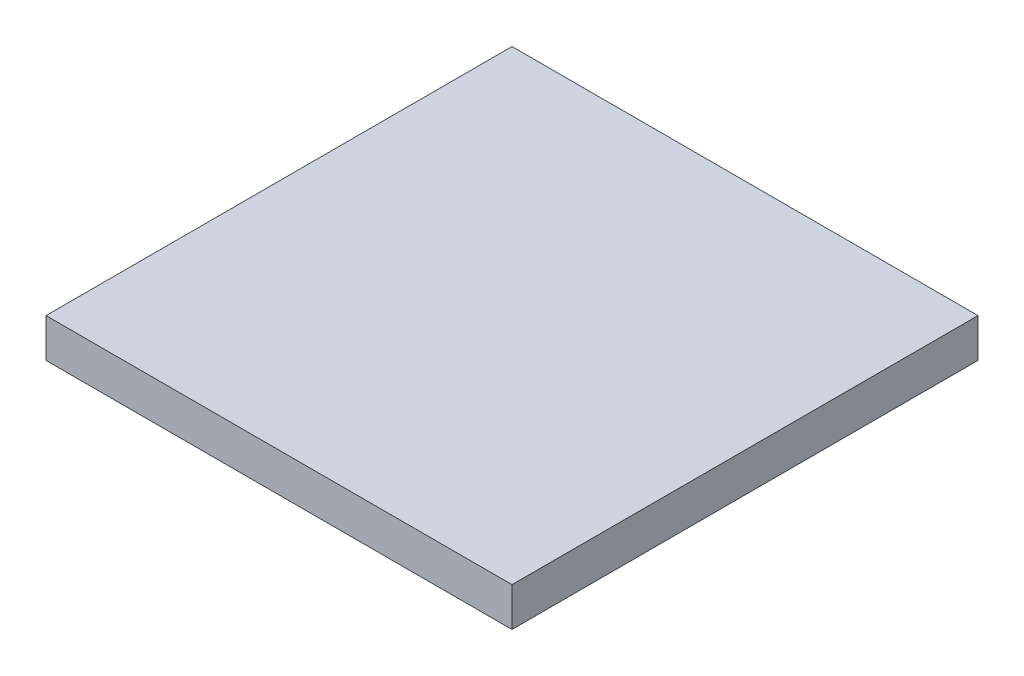
ISO-10303-21;
HEADER;
FILE_DESCRIPTION(('STEP AP214'),'2;1');
FILE_NAME('part.step','',(''),(''),'','','');
FILE_SCHEMA(('AUTOMOTIVE_DESIGN { 1 0 10303 214 1 1 1 1 }'));
ENDSEC;
DATA;
#1=APPLICATION_CONTEXT('core data for automotive mechanical design processes');
#2=APPLICATION_PROTOCOL_DEFINITION('international standard','automotive_design',2000,#1);
#3=PRODUCT_CONTEXT('',#1,'mechanical');
#4=PRODUCT('Part','Part','',(#3));
#5=PRODUCT_RELATED_PRODUCT_CATEGORY('part','',(#4));
#6=PRODUCT_DEFINITION_FORMATION('','',#4);
#7=PRODUCT_DEFINITION_CONTEXT('part definition',#1,'design');
#8=PRODUCT_DEFINITION('design','',#6,#7);
#9=PRODUCT_DEFINITION_SHAPE('','',#8);
#10=(LENGTH_UNIT() NAMED_UNIT(*) SI_UNIT(.MILLI.,.METRE.));
#11=(NAMED_UNIT(*) PLANE_ANGLE_UNIT() SI_UNIT($,.RADIAN.));
#12=(NAMED_UNIT(*) SI_UNIT($,.STERADIAN.) SOLID_ANGLE_UNIT());
#13=UNCERTAINTY_MEASURE_WITH_UNIT(LENGTH_MEASURE(1.E-05),#10,'distance_accuracy_value','');
#14=(GEOMETRIC_REPRESENTATION_CONTEXT(3) GLOBAL_UNCERTAINTY_ASSIGNED_CONTEXT((#13)) GLOBAL_UNIT_ASSIGNED_CONTEXT((#10,
#11,#12)) REPRESENTATION_CONTEXT('',''));
#15=CARTESIAN_POINT('',(0.,0.,0.));
#16=DIRECTION('',(0.,0.,1.));
#17=DIRECTION('',(1.,0.,0.));
#18=AXIS2_PLACEMENT_3D('',#15,#16,#17);
#19=CARTESIAN_POINT('',(0.,5.,0.));
#20=DIRECTION('',(1.,0.,0.));
#21=DIRECTION('',(0.,0.,-1.));
#22=AXIS2_PLACEMENT_3D('',#19,#20,#21);
#23=PLANE('',#22);
#24=DIRECTION('',(0.,0.,1.));
#25=VECTOR('',#24,1.);
#26=CARTESIAN_POINT('',(0.,0.,0.));
#27=LINE('',#26,#25);
#28=CARTESIAN_POINT('',(0.,0.,-60.));
#29=VERTEX_POINT('',#28);
#30=CARTESIAN_POINT('',(0.,0.,0.));
#31=VERTEX_POINT('',#30);
#32=EDGE_CURVE('E96',#29,#31,#27,.T.);
#33=ORIENTED_EDGE('',*,*,#32,.T.);
#34=DIRECTION('',(0.,-1.,0.));
#35=VECTOR('',#34,1.);
#36=CARTESIAN_POINT('',(0.,5.,0.));
#37=LINE('',#36,#35);
#38=CARTESIAN_POINT('',(0.,5.,0.));
#39=VERTEX_POINT('',#38);
#40=EDGE_CURVE('E11',#39,#31,#37,.T.);
#41=ORIENTED_EDGE('',*,*,#40,.F.);
#42=DIRECTION('',(0.,0.,1.));
#43=VECTOR('',#42,1.);
#44=CARTESIAN_POINT('',(0.,5.,0.));
#45=LINE('',#44,#43);
#46=CARTESIAN_POINT('',(0.,5.,-60.));
#47=VERTEX_POINT('',#46);
#48=EDGE_CURVE('E84',#47,#39,#45,.T.);
#49=ORIENTED_EDGE('',*,*,#48,.F.);
#50=DIRECTION('',(0.,-1.,0.));
#51=VECTOR('',#50,1.);
#52=CARTESIAN_POINT('',(0.,5.,-60.));
#53=LINE('',#52,#51);
#54=EDGE_CURVE('E92',#47,#29,#53,.T.);
#55=ORIENTED_EDGE('',*,*,#54,.T.);
#56=EDGE_LOOP('',(#33,#41,#49,#55));
#57=FACE_BOUND('',#56,.T.);
#58=ADVANCED_FACE('F33',(#57),#23,.F.);
#59=CARTESIAN_POINT('',(0.,5.,0.));
#60=DIRECTION('',(0.,0.,-1.));
#61=DIRECTION('',(-1.,0.,0.));
#62=AXIS2_PLACEMENT_3D('',#59,#60,#61);
#63=PLANE('',#62);
#64=DIRECTION('',(1.,0.,0.));
#65=VECTOR('',#64,1.);
#66=CARTESIAN_POINT('',(0.,0.,0.));
#67=LINE('',#66,#65);
#68=CARTESIAN_POINT('',(60.,0.,0.));
#69=VERTEX_POINT('',#68);
#70=EDGE_CURVE('E88',#31,#69,#67,.T.);
#71=ORIENTED_EDGE('',*,*,#70,.T.);
#72=DIRECTION('',(0.,-1.,0.));
#73=VECTOR('',#72,1.);
#74=CARTESIAN_POINT('',(60.,5.,0.));
#75=LINE('',#74,#73);
#76=CARTESIAN_POINT('',(60.,5.,0.));
#77=VERTEX_POINT('',#76);
#78=EDGE_CURVE('E41',#77,#69,#75,.T.);
#79=ORIENTED_EDGE('',*,*,#78,.F.);
#80=DIRECTION('',(1.,0.,0.));
#81=VECTOR('',#80,1.);
#82=CARTESIAN_POINT('',(0.,5.,0.));
#83=LINE('',#82,#81);
#84=EDGE_CURVE('E79',#39,#77,#83,.T.);
#85=ORIENTED_EDGE('',*,*,#84,.F.);
#86=ORIENTED_EDGE('',*,*,#40,.T.);
#87=EDGE_LOOP('',(#71,#79,#85,#86));
#88=FACE_BOUND('',#87,.T.);
#89=ADVANCED_FACE('F87',(#88),#63,.F.);
#90=CARTESIAN_POINT('',(60.,5.,0.));
#91=DIRECTION('',(-1.,0.,0.));
#92=DIRECTION('',(0.,0.,1.));
#93=AXIS2_PLACEMENT_3D('',#90,#91,#92);
#94=PLANE('',#93);
#95=DIRECTION('',(0.,0.,-1.));
#96=VECTOR('',#95,1.);
#97=CARTESIAN_POINT('',(60.,0.,0.));
#98=LINE('',#97,#96);
#99=CARTESIAN_POINT('',(60.,0.,-60.));
#100=VERTEX_POINT('',#99);
#101=EDGE_CURVE('E66',#69,#100,#98,.T.);
#102=ORIENTED_EDGE('',*,*,#101,.T.);
#103=DIRECTION('',(0.,-1.,0.));
#104=VECTOR('',#103,1.);
#105=CARTESIAN_POINT('',(60.,5.,-60.));
#106=LINE('',#105,#104);
#107=CARTESIAN_POINT('',(60.,5.,-60.));
#108=VERTEX_POINT('',#107);
#109=EDGE_CURVE('E89',#108,#100,#106,.T.);
#110=ORIENTED_EDGE('',*,*,#109,.F.);
#111=DIRECTION('',(0.,0.,-1.));
#112=VECTOR('',#111,1.);
#113=CARTESIAN_POINT('',(60.,5.,0.));
#114=LINE('',#113,#112);
#115=EDGE_CURVE('E82',#77,#108,#114,.T.);
#116=ORIENTED_EDGE('',*,*,#115,.F.);
#117=ORIENTED_EDGE('',*,*,#78,.T.);
#118=EDGE_LOOP('',(#102,#110,#116,#117));
#119=FACE_BOUND('',#118,.T.);
#120=ADVANCED_FACE('F90',(#119),#94,.F.);
#121=CARTESIAN_POINT('',(0.,5.,-60.));
#122=DIRECTION('',(0.,0.,1.));
#123=DIRECTION('',(1.,0.,0.));
#124=AXIS2_PLACEMENT_3D('',#121,#122,#123);
#125=PLANE('',#124);
#126=DIRECTION('',(-1.,0.,0.));
#127=VECTOR('',#126,1.);
#128=CARTESIAN_POINT('',(0.,0.,-60.));
#129=LINE('',#128,#127);
#130=EDGE_CURVE('E72',#100,#29,#129,.T.);
#131=ORIENTED_EDGE('',*,*,#130,.T.);
#132=ORIENTED_EDGE('',*,*,#54,.F.);
#133=DIRECTION('',(-1.,0.,0.));
#134=VECTOR('',#133,1.);
#135=CARTESIAN_POINT('',(0.,5.,-60.));
#136=LINE('',#135,#134);
#137=EDGE_CURVE('E49',#108,#47,#136,.T.);
#138=ORIENTED_EDGE('',*,*,#137,.F.);
#139=ORIENTED_EDGE('',*,*,#109,.T.);
#140=EDGE_LOOP('',(#131,#132,#138,#139));
#141=FACE_BOUND('',#140,.T.);
#142=ADVANCED_FACE('F103',(#141),#125,.F.);
#143=CARTESIAN_POINT('',(0.,5.,0.));
#144=DIRECTION('',(0.,-1.,0.));
#145=DIRECTION('',(0.,0.,-1.));
#146=AXIS2_PLACEMENT_3D('',#143,#144,#145);
#147=PLANE('',#146);
#148=ORIENTED_EDGE('',*,*,#48,.T.);
#149=ORIENTED_EDGE('',*,*,#84,.T.);
#150=ORIENTED_EDGE('',*,*,#115,.T.);
#151=ORIENTED_EDGE('',*,*,#137,.T.);
#152=EDGE_LOOP('',(#148,#149,#150,#151));
#153=FACE_BOUND('',#152,.T.);
#154=ADVANCED_FACE('F80',(#153),#147,.F.);
#155=CARTESIAN_POINT('',(0.,0.,0.));
#156=DIRECTION('',(0.,-1.,0.));
#157=DIRECTION('',(0.,0.,-1.));
#158=AXIS2_PLACEMENT_3D('',#155,#156,#157);
#159=PLANE('',#158);
#160=ORIENTED_EDGE('',*,*,#32,.F.);
#161=ORIENTED_EDGE('',*,*,#130,.F.);
#162=ORIENTED_EDGE('',*,*,#101,.F.);
#163=ORIENTED_EDGE('',*,*,#70,.F.);
#164=EDGE_LOOP('',(#160,#161,#162,#163));
#165=FACE_BOUND('',#164,.T.);
#166=ADVANCED_FACE('F106',(#165),#159,.T.);
#167=CLOSED_SHELL('',(#58,#89,#120,#142,#154,#166));
#168=MANIFOLD_SOLID_BREP('B2',#167);
#169=ADVANCED_BREP_SHAPE_REPRESENTATION('',(#18,#168),#14);
#170=SHAPE_DEFINITION_REPRESENTATION(#9,#169);
ENDSEC;
END-ISO-10303-21;
